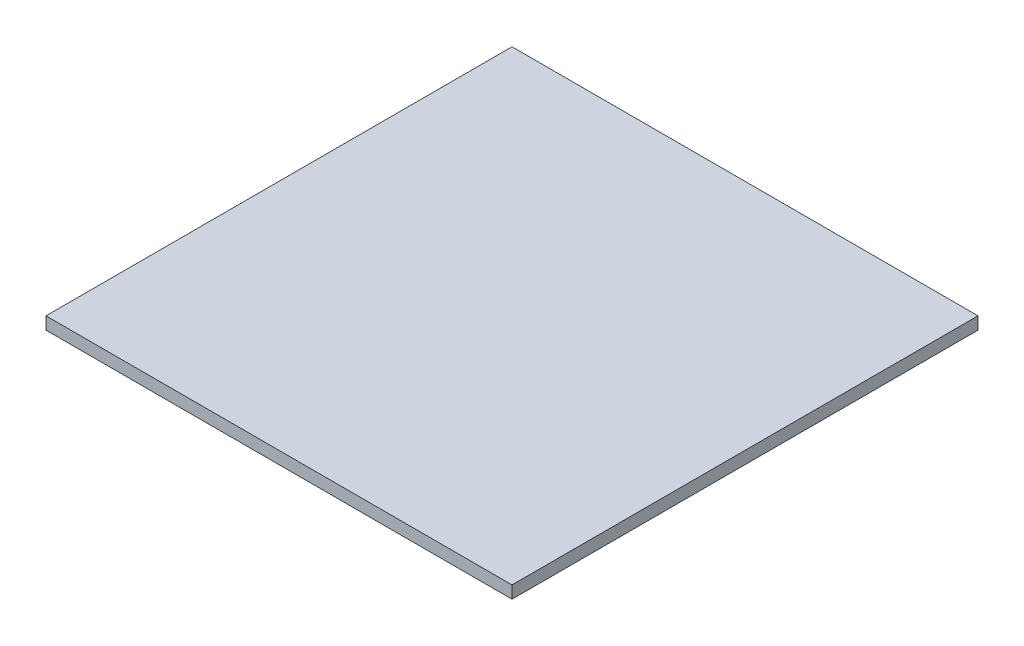
ISO-10303-21;
HEADER;
FILE_DESCRIPTION(('STEP AP214'),'2;1');
FILE_NAME('part.step','',(''),(''),'','','');
FILE_SCHEMA(('AUTOMOTIVE_DESIGN { 1 0 10303 214 1 1 1 1 }'));
ENDSEC;
DATA;
#1=APPLICATION_CONTEXT('core data for automotive mechanical design processes');
#2=APPLICATION_PROTOCOL_DEFINITION('international standard','automotive_design',2000,#1);
#3=PRODUCT_CONTEXT('',#1,'mechanical');
#4=PRODUCT('Part','Part','',(#3));
#5=PRODUCT_RELATED_PRODUCT_CATEGORY('part','',(#4));
#6=PRODUCT_DEFINITION_FORMATION('','',#4);
#7=PRODUCT_DEFINITION_CONTEXT('part definition',#1,'design');
#8=PRODUCT_DEFINITION('design','',#6,#7);
#9=PRODUCT_DEFINITION_SHAPE('','',#8);
#10=(LENGTH_UNIT() NAMED_UNIT(*) SI_UNIT(.MILLI.,.METRE.));
#11=(NAMED_UNIT(*) PLANE_ANGLE_UNIT() SI_UNIT($,.RADIAN.));
#12=(NAMED_UNIT(*) SI_UNIT($,.STERADIAN.) SOLID_ANGLE_UNIT());
#13=UNCERTAINTY_MEASURE_WITH_UNIT(LENGTH_MEASURE(1.E-05),#10,'distance_accuracy_value','');
#14=(GEOMETRIC_REPRESENTATION_CONTEXT(3) GLOBAL_UNCERTAINTY_ASSIGNED_CONTEXT((#13)) GLOBAL_UNIT_ASSIGNED_CONTEXT((#10,
#11,#12)) REPRESENTATION_CONTEXT('',''));
#15=CARTESIAN_POINT('',(0.,0.,0.));
#16=DIRECTION('',(0.,0.,1.));
#17=DIRECTION('',(1.,0.,0.));
#18=AXIS2_PLACEMENT_3D('',#15,#16,#17);
#19=CARTESIAN_POINT('',(200.,862.,-450.));
#20=DIRECTION('',(-1.,0.,0.));
#21=DIRECTION('',(0.,0.,1.));
#22=AXIS2_PLACEMENT_3D('',#19,#20,#21);
#23=PLANE('',#22);
#24=DIRECTION('',(0.,-1.,0.));
#25=VECTOR('',#24,1.);
#26=CARTESIAN_POINT('',(200.,862.,-150.));
#27=LINE('',#26,#25);
#28=CARTESIAN_POINT('',(200.,870.,-150.));
#29=VERTEX_POINT('',#28);
#30=CARTESIAN_POINT('',(200.,862.,-150.));
#31=VERTEX_POINT('',#30);
#32=EDGE_CURVE('E103',#29,#31,#27,.T.);
#33=ORIENTED_EDGE('',*,*,#32,.F.);
#34=DIRECTION('',(0.,0.,1.));
#35=VECTOR('',#34,1.);
#36=CARTESIAN_POINT('',(200.,870.,-450.));
#37=LINE('',#36,#35);
#38=CARTESIAN_POINT('',(200.,870.,-450.));
#39=VERTEX_POINT('',#38);
#40=EDGE_CURVE('E11',#39,#29,#37,.T.);
#41=ORIENTED_EDGE('',*,*,#40,.F.);
#42=DIRECTION('',(0.,-1.,0.));
#43=VECTOR('',#42,1.);
#44=CARTESIAN_POINT('',(200.,862.,-450.));
#45=LINE('',#44,#43);
#46=CARTESIAN_POINT('',(200.,862.,-450.));
#47=VERTEX_POINT('',#46);
#48=EDGE_CURVE('E97',#39,#47,#45,.T.);
#49=ORIENTED_EDGE('',*,*,#48,.T.);
#50=DIRECTION('',(0.,0.,1.));
#51=VECTOR('',#50,1.);
#52=CARTESIAN_POINT('',(200.,862.,-450.));
#53=LINE('',#52,#51);
#54=EDGE_CURVE('E42',#47,#31,#53,.T.);
#55=ORIENTED_EDGE('',*,*,#54,.T.);
#56=EDGE_LOOP('',(#33,#41,#49,#55));
#57=FACE_BOUND('',#56,.T.);
#58=ADVANCED_FACE('F39',(#57),#23,.T.);
#59=CARTESIAN_POINT('',(200.,870.,-450.));
#60=DIRECTION('',(0.,1.,0.));
#61=DIRECTION('',(0.,0.,1.));
#62=AXIS2_PLACEMENT_3D('',#59,#60,#61);
#63=PLANE('',#62);
#64=DIRECTION('',(-1.,0.,0.));
#65=VECTOR('',#64,1.);
#66=CARTESIAN_POINT('',(200.,870.,-150.));
#67=LINE('',#66,#65);
#68=CARTESIAN_POINT('',(500.,870.,-150.));
#69=VERTEX_POINT('',#68);
#70=EDGE_CURVE('E99',#69,#29,#67,.T.);
#71=ORIENTED_EDGE('',*,*,#70,.F.);
#72=DIRECTION('',(0.,0.,1.));
#73=VECTOR('',#72,1.);
#74=CARTESIAN_POINT('',(500.,870.,-450.));
#75=LINE('',#74,#73);
#76=CARTESIAN_POINT('',(500.,870.,-450.));
#77=VERTEX_POINT('',#76);
#78=EDGE_CURVE('E48',#77,#69,#75,.T.);
#79=ORIENTED_EDGE('',*,*,#78,.F.);
#80=DIRECTION('',(-1.,0.,0.));
#81=VECTOR('',#80,1.);
#82=CARTESIAN_POINT('',(200.,870.,-450.));
#83=LINE('',#82,#81);
#84=EDGE_CURVE('E94',#77,#39,#83,.T.);
#85=ORIENTED_EDGE('',*,*,#84,.T.);
#86=ORIENTED_EDGE('',*,*,#40,.T.);
#87=EDGE_LOOP('',(#71,#79,#85,#86));
#88=FACE_BOUND('',#87,.T.);
#89=ADVANCED_FACE('F113',(#88),#63,.T.);
#90=CARTESIAN_POINT('',(500.,862.,-450.));
#91=DIRECTION('',(1.,0.,0.));
#92=DIRECTION('',(0.,0.,-1.));
#93=AXIS2_PLACEMENT_3D('',#90,#91,#92);
#94=PLANE('',#93);
#95=DIRECTION('',(0.,1.,0.));
#96=VECTOR('',#95,1.);
#97=CARTESIAN_POINT('',(500.,862.,-150.));
#98=LINE('',#97,#96);
#99=CARTESIAN_POINT('',(500.,862.,-150.));
#100=VERTEX_POINT('',#99);
#101=EDGE_CURVE('E89',#100,#69,#98,.T.);
#102=ORIENTED_EDGE('',*,*,#101,.F.);
#103=DIRECTION('',(0.,0.,1.));
#104=VECTOR('',#103,1.);
#105=CARTESIAN_POINT('',(500.,862.,-450.));
#106=LINE('',#105,#104);
#107=CARTESIAN_POINT('',(500.,862.,-450.));
#108=VERTEX_POINT('',#107);
#109=EDGE_CURVE('E84',#108,#100,#106,.T.);
#110=ORIENTED_EDGE('',*,*,#109,.F.);
#111=DIRECTION('',(0.,1.,0.));
#112=VECTOR('',#111,1.);
#113=CARTESIAN_POINT('',(500.,862.,-450.));
#114=LINE('',#113,#112);
#115=EDGE_CURVE('E87',#108,#77,#114,.T.);
#116=ORIENTED_EDGE('',*,*,#115,.T.);
#117=ORIENTED_EDGE('',*,*,#78,.T.);
#118=EDGE_LOOP('',(#102,#110,#116,#117));
#119=FACE_BOUND('',#118,.T.);
#120=ADVANCED_FACE('F86',(#119),#94,.T.);
#121=CARTESIAN_POINT('',(200.,862.,-450.));
#122=DIRECTION('',(0.,-1.,0.));
#123=DIRECTION('',(0.,0.,-1.));
#124=AXIS2_PLACEMENT_3D('',#121,#122,#123);
#125=PLANE('',#124);
#126=DIRECTION('',(1.,0.,0.));
#127=VECTOR('',#126,1.);
#128=CARTESIAN_POINT('',(200.,862.,-150.));
#129=LINE('',#128,#127);
#130=EDGE_CURVE('E106',#31,#100,#129,.T.);
#131=ORIENTED_EDGE('',*,*,#130,.F.);
#132=ORIENTED_EDGE('',*,*,#54,.F.);
#133=DIRECTION('',(1.,0.,0.));
#134=VECTOR('',#133,1.);
#135=CARTESIAN_POINT('',(200.,862.,-450.));
#136=LINE('',#135,#134);
#137=EDGE_CURVE('E93',#47,#108,#136,.T.);
#138=ORIENTED_EDGE('',*,*,#137,.T.);
#139=ORIENTED_EDGE('',*,*,#109,.T.);
#140=EDGE_LOOP('',(#131,#132,#138,#139));
#141=FACE_BOUND('',#140,.T.);
#142=ADVANCED_FACE('F96',(#141),#125,.T.);
#143=CARTESIAN_POINT('',(0.,0.,-450.));
#144=DIRECTION('',(0.,0.,-1.));
#145=DIRECTION('',(-1.,0.,0.));
#146=AXIS2_PLACEMENT_3D('',#143,#144,#145);
#147=PLANE('',#146);
#148=ORIENTED_EDGE('',*,*,#48,.F.);
#149=ORIENTED_EDGE('',*,*,#84,.F.);
#150=ORIENTED_EDGE('',*,*,#115,.F.);
#151=ORIENTED_EDGE('',*,*,#137,.F.);
#152=EDGE_LOOP('',(#148,#149,#150,#151));
#153=FACE_BOUND('',#152,.T.);
#154=ADVANCED_FACE('F92',(#153),#147,.T.);
#155=CARTESIAN_POINT('',(0.,0.,-150.));
#156=DIRECTION('',(0.,0.,-1.));
#157=DIRECTION('',(-1.,0.,0.));
#158=AXIS2_PLACEMENT_3D('',#155,#156,#157);
#159=PLANE('',#158);
#160=ORIENTED_EDGE('',*,*,#32,.T.);
#161=ORIENTED_EDGE('',*,*,#130,.T.);
#162=ORIENTED_EDGE('',*,*,#101,.T.);
#163=ORIENTED_EDGE('',*,*,#70,.T.);
#164=EDGE_LOOP('',(#160,#161,#162,#163));
#165=FACE_BOUND('',#164,.T.);
#166=ADVANCED_FACE('F112',(#165),#159,.F.);
#167=CLOSED_SHELL('',(#58,#89,#120,#142,#154,#166));
#168=MANIFOLD_SOLID_BREP('B2',#167);
#169=ADVANCED_BREP_SHAPE_REPRESENTATION('',(#18,#168),#14);
#170=SHAPE_DEFINITION_REPRESENTATION(#9,#169);
ENDSEC;
END-ISO-10303-21;
